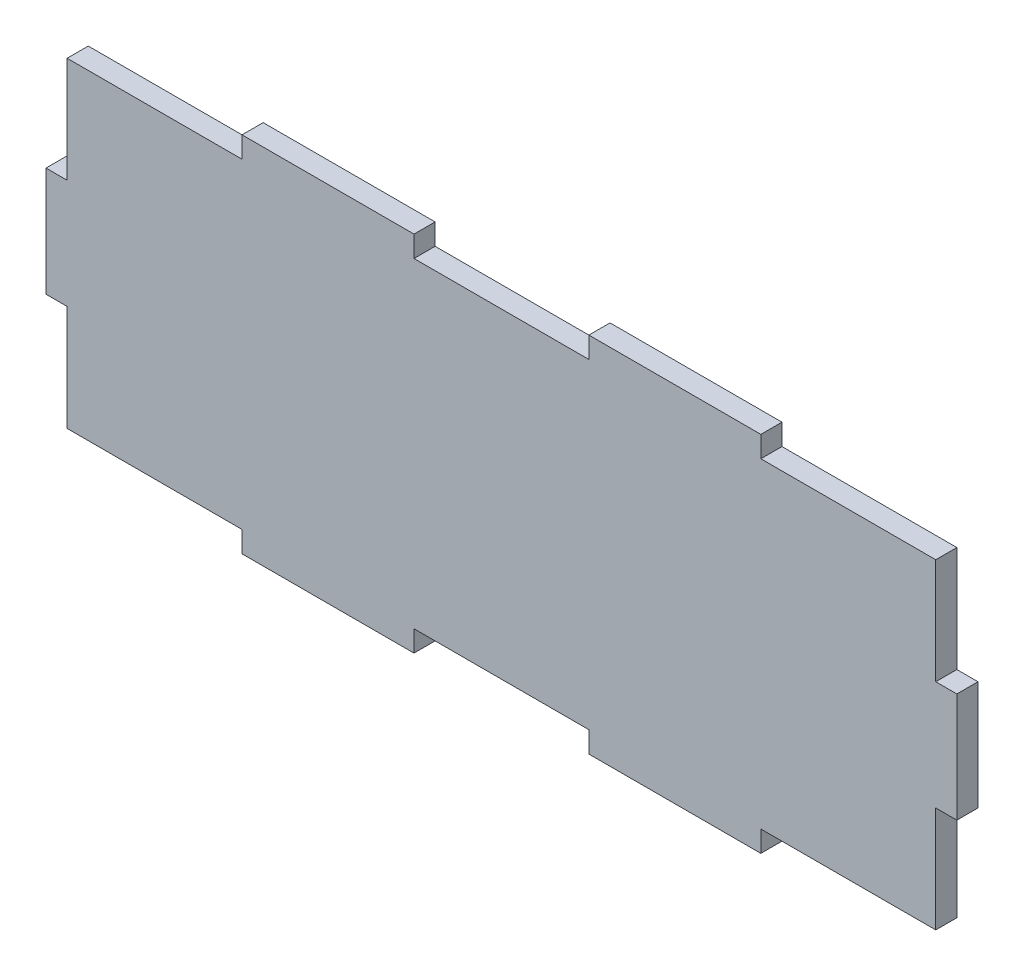
ISO-10303-21;
HEADER;
FILE_DESCRIPTION(('STEP AP214'),'2;1');
FILE_NAME('part.step','',(''),(''),'','','');
FILE_SCHEMA(('AUTOMOTIVE_DESIGN { 1 0 10303 214 1 1 1 1 }'));
ENDSEC;
DATA;
#1=APPLICATION_CONTEXT('core data for automotive mechanical design processes');
#2=APPLICATION_PROTOCOL_DEFINITION('international standard','automotive_design',2000,#1);
#3=PRODUCT_CONTEXT('',#1,'mechanical');
#4=PRODUCT('Part','Part','',(#3));
#5=PRODUCT_RELATED_PRODUCT_CATEGORY('part','',(#4));
#6=PRODUCT_DEFINITION_FORMATION('','',#4);
#7=PRODUCT_DEFINITION_CONTEXT('part definition',#1,'design');
#8=PRODUCT_DEFINITION('design','',#6,#7);
#9=PRODUCT_DEFINITION_SHAPE('','',#8);
#10=(LENGTH_UNIT() NAMED_UNIT(*) SI_UNIT(.MILLI.,.METRE.));
#11=(NAMED_UNIT(*) PLANE_ANGLE_UNIT() SI_UNIT($,.RADIAN.));
#12=(NAMED_UNIT(*) SI_UNIT($,.STERADIAN.) SOLID_ANGLE_UNIT());
#13=UNCERTAINTY_MEASURE_WITH_UNIT(LENGTH_MEASURE(1.E-05),#10,'distance_accuracy_value','');
#14=(GEOMETRIC_REPRESENTATION_CONTEXT(3) GLOBAL_UNCERTAINTY_ASSIGNED_CONTEXT((#13)) GLOBAL_UNIT_ASSIGNED_CONTEXT((#10,
#11,#12)) REPRESENTATION_CONTEXT('',''));
#15=CARTESIAN_POINT('',(0.,0.,0.));
#16=DIRECTION('',(0.,0.,1.));
#17=DIRECTION('',(1.,0.,0.));
#18=AXIS2_PLACEMENT_3D('',#15,#16,#17);
#19=CARTESIAN_POINT('',(0.,0.,5.8));
#20=DIRECTION('',(0.,1.,0.));
#21=DIRECTION('',(0.,0.,1.));
#22=AXIS2_PLACEMENT_3D('',#19,#20,#21);
#23=PLANE('',#22);
#24=DIRECTION('',(1.,0.,0.));
#25=VECTOR('',#24,1.);
#26=CARTESIAN_POINT('',(0.,0.,5.8));
#27=LINE('',#26,#25);
#28=CARTESIAN_POINT('',(190.4,0.,5.8));
#29=VERTEX_POINT('',#28);
#30=CARTESIAN_POINT('',(238.4,0.,5.8));
#31=VERTEX_POINT('',#30);
#32=EDGE_CURVE('E50',#29,#31,#27,.T.);
#33=ORIENTED_EDGE('',*,*,#32,.F.);
#34=DIRECTION('',(0.,0.,1.));
#35=VECTOR('',#34,1.);
#36=CARTESIAN_POINT('',(190.4,0.,-47.555020765425));
#37=LINE('',#36,#35);
#38=CARTESIAN_POINT('',(190.4,0.,0.));
#39=VERTEX_POINT('',#38);
#40=EDGE_CURVE('E232',#39,#29,#37,.T.);
#41=ORIENTED_EDGE('',*,*,#40,.F.);
#42=DIRECTION('',(1.,0.,0.));
#43=VECTOR('',#42,1.);
#44=CARTESIAN_POINT('',(0.,0.,0.));
#45=LINE('',#44,#43);
#46=CARTESIAN_POINT('',(238.4,0.,0.));
#47=VERTEX_POINT('',#46);
#48=EDGE_CURVE('E230',#39,#47,#45,.T.);
#49=ORIENTED_EDGE('',*,*,#48,.T.);
#50=DIRECTION('',(0.,0.,-1.));
#51=VECTOR('',#50,1.);
#52=CARTESIAN_POINT('',(238.4,0.,5.8));
#53=LINE('',#52,#51);
#54=EDGE_CURVE('E43',#31,#47,#53,.T.);
#55=ORIENTED_EDGE('',*,*,#54,.F.);
#56=EDGE_LOOP('',(#33,#41,#49,#55));
#57=FACE_BOUND('',#56,.T.);
#58=ADVANCED_FACE('F35',(#57),#23,.F.);
#59=CARTESIAN_POINT('',(95.2,0.,0.));
#60=VERTEX_POINT('',#59);
#61=CARTESIAN_POINT('',(143.2,0.,0.));
#62=VERTEX_POINT('',#61);
#63=EDGE_CURVE('E415',#60,#62,#45,.T.);
#64=ORIENTED_EDGE('',*,*,#63,.T.);
#65=DIRECTION('',(0.,0.,1.));
#66=VECTOR('',#65,1.);
#67=CARTESIAN_POINT('',(143.2,0.,-47.555020765425));
#68=LINE('',#67,#66);
#69=CARTESIAN_POINT('',(143.2,0.,5.8));
#70=VERTEX_POINT('',#69);
#71=EDGE_CURVE('E58',#62,#70,#68,.T.);
#72=ORIENTED_EDGE('',*,*,#71,.T.);
#73=CARTESIAN_POINT('',(95.2,0.,5.8));
#74=VERTEX_POINT('',#73);
#75=EDGE_CURVE('E398',#74,#70,#27,.T.);
#76=ORIENTED_EDGE('',*,*,#75,.F.);
#77=DIRECTION('',(0.,0.,1.));
#78=VECTOR('',#77,1.);
#79=CARTESIAN_POINT('',(95.2,0.,-47.555020765425));
#80=LINE('',#79,#78);
#81=EDGE_CURVE('E278',#60,#74,#80,.T.);
#82=ORIENTED_EDGE('',*,*,#81,.F.);
#83=EDGE_LOOP('',(#64,#72,#76,#82));
#84=FACE_BOUND('',#83,.T.);
#85=ADVANCED_FACE('F446',(#84),#23,.F.);
#86=CARTESIAN_POINT('',(0.,88.,5.8));
#87=DIRECTION('',(0.,-1.,0.));
#88=DIRECTION('',(0.,0.,-1.));
#89=AXIS2_PLACEMENT_3D('',#86,#87,#88);
#90=PLANE('',#89);
#91=DIRECTION('',(-1.,0.,0.));
#92=VECTOR('',#91,1.);
#93=CARTESIAN_POINT('',(0.,88.,0.));
#94=LINE('',#93,#92);
#95=CARTESIAN_POINT('',(238.4,88.,0.));
#96=VERTEX_POINT('',#95);
#97=CARTESIAN_POINT('',(190.4,88.,0.));
#98=VERTEX_POINT('',#97);
#99=EDGE_CURVE('E420',#96,#98,#94,.T.);
#100=ORIENTED_EDGE('',*,*,#99,.T.);
#101=DIRECTION('',(0.,0.,1.));
#102=VECTOR('',#101,1.);
#103=CARTESIAN_POINT('',(190.4,88.,-47.555020765425));
#104=LINE('',#103,#102);
#105=CARTESIAN_POINT('',(190.4,88.,5.8));
#106=VERTEX_POINT('',#105);
#107=EDGE_CURVE('E288',#98,#106,#104,.T.);
#108=ORIENTED_EDGE('',*,*,#107,.T.);
#109=DIRECTION('',(-1.,0.,0.));
#110=VECTOR('',#109,1.);
#111=CARTESIAN_POINT('',(0.,88.,5.8));
#112=LINE('',#111,#110);
#113=CARTESIAN_POINT('',(238.4,88.,5.8));
#114=VERTEX_POINT('',#113);
#115=EDGE_CURVE('E403',#114,#106,#112,.T.);
#116=ORIENTED_EDGE('',*,*,#115,.F.);
#117=DIRECTION('',(0.,0.,-1.));
#118=VECTOR('',#117,1.);
#119=CARTESIAN_POINT('',(238.4,88.,5.8));
#120=LINE('',#119,#118);
#121=EDGE_CURVE('E425',#114,#96,#120,.T.);
#122=ORIENTED_EDGE('',*,*,#121,.T.);
#123=EDGE_LOOP('',(#100,#108,#116,#122));
#124=FACE_BOUND('',#123,.T.);
#125=ADVANCED_FACE('F451',(#124),#90,.F.);
#126=DIRECTION('',(0.,0.,1.));
#127=VECTOR('',#126,1.);
#128=CARTESIAN_POINT('',(48.,88.,-47.555020765425));
#129=LINE('',#128,#127);
#130=CARTESIAN_POINT('',(48.,88.,0.));
#131=VERTEX_POINT('',#130);
#132=CARTESIAN_POINT('',(48.,88.,5.8));
#133=VERTEX_POINT('',#132);
#134=EDGE_CURVE('E323',#131,#133,#129,.T.);
#135=ORIENTED_EDGE('',*,*,#134,.F.);
#136=CARTESIAN_POINT('',(0.,88.,0.));
#137=VERTEX_POINT('',#136);
#138=EDGE_CURVE('E419',#131,#137,#94,.T.);
#139=ORIENTED_EDGE('',*,*,#138,.T.);
#140=DIRECTION('',(0.,0.,-1.));
#141=VECTOR('',#140,1.);
#142=CARTESIAN_POINT('',(0.,88.,5.8));
#143=LINE('',#142,#141);
#144=CARTESIAN_POINT('',(0.,88.,5.8));
#145=VERTEX_POINT('',#144);
#146=EDGE_CURVE('E406',#145,#137,#143,.T.);
#147=ORIENTED_EDGE('',*,*,#146,.F.);
#148=EDGE_CURVE('E402',#133,#145,#112,.T.);
#149=ORIENTED_EDGE('',*,*,#148,.F.);
#150=EDGE_LOOP('',(#135,#139,#147,#149));
#151=FACE_BOUND('',#150,.T.);
#152=ADVANCED_FACE('F492',(#151),#90,.F.);
#153=CARTESIAN_POINT('',(238.4,0.,5.8));
#154=DIRECTION('',(-1.,0.,0.));
#155=DIRECTION('',(0.,0.,1.));
#156=AXIS2_PLACEMENT_3D('',#153,#154,#155);
#157=PLANE('',#156);
#158=DIRECTION('',(0.,0.,1.));
#159=VECTOR('',#158,1.);
#160=CARTESIAN_POINT('',(238.4,59.,-47.555020765425));
#161=LINE('',#160,#159);
#162=CARTESIAN_POINT('',(238.4,59.,0.));
#163=VERTEX_POINT('',#162);
#164=CARTESIAN_POINT('',(238.4,59.,5.8));
#165=VERTEX_POINT('',#164);
#166=EDGE_CURVE('E352',#163,#165,#161,.T.);
#167=ORIENTED_EDGE('',*,*,#166,.F.);
#168=DIRECTION('',(0.,1.,0.));
#169=VECTOR('',#168,1.);
#170=CARTESIAN_POINT('',(238.4,0.,0.));
#171=LINE('',#170,#169);
#172=EDGE_CURVE('E414',#163,#96,#171,.T.);
#173=ORIENTED_EDGE('',*,*,#172,.T.);
#174=ORIENTED_EDGE('',*,*,#121,.F.);
#175=DIRECTION('',(0.,1.,0.));
#176=VECTOR('',#175,1.);
#177=CARTESIAN_POINT('',(238.4,0.,5.8));
#178=LINE('',#177,#176);
#179=EDGE_CURVE('E397',#165,#114,#178,.T.);
#180=ORIENTED_EDGE('',*,*,#179,.F.);
#181=EDGE_LOOP('',(#167,#173,#174,#180));
#182=FACE_BOUND('',#181,.T.);
#183=ADVANCED_FACE('F460',(#182),#157,.F.);
#184=CARTESIAN_POINT('',(0.,0.,5.8));
#185=DIRECTION('',(1.,0.,0.));
#186=DIRECTION('',(0.,0.,-1.));
#187=AXIS2_PLACEMENT_3D('',#184,#185,#186);
#188=PLANE('',#187);
#189=DIRECTION('',(0.,0.,1.));
#190=VECTOR('',#189,1.);
#191=CARTESIAN_POINT('',(0.,29.,-47.555020765425));
#192=LINE('',#191,#190);
#193=CARTESIAN_POINT('',(0.,29.,0.));
#194=VERTEX_POINT('',#193);
#195=CARTESIAN_POINT('',(0.,29.,5.8));
#196=VERTEX_POINT('',#195);
#197=EDGE_CURVE('E378',#194,#196,#192,.T.);
#198=ORIENTED_EDGE('',*,*,#197,.F.);
#199=DIRECTION('',(0.,-1.,0.));
#200=VECTOR('',#199,1.);
#201=CARTESIAN_POINT('',(0.,0.,0.));
#202=LINE('',#201,#200);
#203=CARTESIAN_POINT('',(0.,0.,0.));
#204=VERTEX_POINT('',#203);
#205=EDGE_CURVE('E389',#194,#204,#202,.T.);
#206=ORIENTED_EDGE('',*,*,#205,.T.);
#207=DIRECTION('',(0.,0.,-1.));
#208=VECTOR('',#207,1.);
#209=CARTESIAN_POINT('',(0.,0.,5.8));
#210=LINE('',#209,#208);
#211=CARTESIAN_POINT('',(0.,0.,5.8));
#212=VERTEX_POINT('',#211);
#213=EDGE_CURVE('E11',#212,#204,#210,.T.);
#214=ORIENTED_EDGE('',*,*,#213,.F.);
#215=DIRECTION('',(0.,-1.,0.));
#216=VECTOR('',#215,1.);
#217=CARTESIAN_POINT('',(0.,0.,5.8));
#218=LINE('',#217,#216);
#219=EDGE_CURVE('E393',#196,#212,#218,.T.);
#220=ORIENTED_EDGE('',*,*,#219,.F.);
#221=EDGE_LOOP('',(#198,#206,#214,#220));
#222=FACE_BOUND('',#221,.T.);
#223=ADVANCED_FACE('F461',(#222),#188,.F.);
#224=CARTESIAN_POINT('',(0.,59.,0.));
#225=VERTEX_POINT('',#224);
#226=EDGE_CURVE('E408',#137,#225,#202,.T.);
#227=ORIENTED_EDGE('',*,*,#226,.T.);
#228=DIRECTION('',(0.,0.,1.));
#229=VECTOR('',#228,1.);
#230=CARTESIAN_POINT('',(0.,59.,-47.555020765425));
#231=LINE('',#230,#229);
#232=CARTESIAN_POINT('',(0.,59.,5.8));
#233=VERTEX_POINT('',#232);
#234=EDGE_CURVE('E384',#225,#233,#231,.T.);
#235=ORIENTED_EDGE('',*,*,#234,.T.);
#236=EDGE_CURVE('E390',#145,#233,#218,.T.);
#237=ORIENTED_EDGE('',*,*,#236,.F.);
#238=ORIENTED_EDGE('',*,*,#146,.T.);
#239=EDGE_LOOP('',(#227,#235,#237,#238));
#240=FACE_BOUND('',#239,.T.);
#241=ADVANCED_FACE('F37',(#240),#188,.F.);
#242=CARTESIAN_POINT('',(48.,0.,0.));
#243=VERTEX_POINT('',#242);
#244=EDGE_CURVE('E411',#204,#243,#45,.T.);
#245=ORIENTED_EDGE('',*,*,#244,.T.);
#246=DIRECTION('',(0.,0.,1.));
#247=VECTOR('',#246,1.);
#248=CARTESIAN_POINT('',(48.,0.,-47.555020765425));
#249=LINE('',#248,#247);
#250=CARTESIAN_POINT('',(48.,0.,5.8));
#251=VERTEX_POINT('',#250);
#252=EDGE_CURVE('E275',#243,#251,#249,.T.);
#253=ORIENTED_EDGE('',*,*,#252,.T.);
#254=EDGE_CURVE('E394',#212,#251,#27,.T.);
#255=ORIENTED_EDGE('',*,*,#254,.F.);
#256=ORIENTED_EDGE('',*,*,#213,.T.);
#257=EDGE_LOOP('',(#245,#253,#255,#256));
#258=FACE_BOUND('',#257,.T.);
#259=ADVANCED_FACE('F447',(#258),#23,.F.);
#260=CARTESIAN_POINT('',(238.4,29.,0.));
#261=VERTEX_POINT('',#260);
#262=EDGE_CURVE('E416',#47,#261,#171,.T.);
#263=ORIENTED_EDGE('',*,*,#262,.T.);
#264=DIRECTION('',(0.,0.,1.));
#265=VECTOR('',#264,1.);
#266=CARTESIAN_POINT('',(238.4,29.,-47.555020765425));
#267=LINE('',#266,#265);
#268=CARTESIAN_POINT('',(238.4,29.,5.8));
#269=VERTEX_POINT('',#268);
#270=EDGE_CURVE('E358',#261,#269,#267,.T.);
#271=ORIENTED_EDGE('',*,*,#270,.T.);
#272=EDGE_CURVE('E399',#31,#269,#178,.T.);
#273=ORIENTED_EDGE('',*,*,#272,.F.);
#274=ORIENTED_EDGE('',*,*,#54,.T.);
#275=EDGE_LOOP('',(#263,#271,#273,#274));
#276=FACE_BOUND('',#275,.T.);
#277=ADVANCED_FACE('F430',(#276),#157,.F.);
#278=CARTESIAN_POINT('',(143.2,88.,5.8));
#279=VERTEX_POINT('',#278);
#280=CARTESIAN_POINT('',(95.2,88.,5.8));
#281=VERTEX_POINT('',#280);
#282=EDGE_CURVE('E407',#279,#281,#112,.T.);
#283=ORIENTED_EDGE('',*,*,#282,.F.);
#284=DIRECTION('',(0.,0.,1.));
#285=VECTOR('',#284,1.);
#286=CARTESIAN_POINT('',(143.2,88.,-47.555020765425));
#287=LINE('',#286,#285);
#288=CARTESIAN_POINT('',(143.2,88.,0.));
#289=VERTEX_POINT('',#288);
#290=EDGE_CURVE('E297',#289,#279,#287,.T.);
#291=ORIENTED_EDGE('',*,*,#290,.F.);
#292=CARTESIAN_POINT('',(95.2,88.,0.));
#293=VERTEX_POINT('',#292);
#294=EDGE_CURVE('E422',#289,#293,#94,.T.);
#295=ORIENTED_EDGE('',*,*,#294,.T.);
#296=DIRECTION('',(0.,0.,1.));
#297=VECTOR('',#296,1.);
#298=CARTESIAN_POINT('',(95.2,88.,-47.555020765425));
#299=LINE('',#298,#297);
#300=EDGE_CURVE('E315',#293,#281,#299,.T.);
#301=ORIENTED_EDGE('',*,*,#300,.T.);
#302=EDGE_LOOP('',(#283,#291,#295,#301));
#303=FACE_BOUND('',#302,.T.);
#304=ADVANCED_FACE('F459',(#303),#90,.F.);
#305=CARTESIAN_POINT('',(0.,0.,5.8));
#306=DIRECTION('',(0.,0.,-1.));
#307=DIRECTION('',(-1.,0.,0.));
#308=AXIS2_PLACEMENT_3D('',#305,#306,#307);
#309=PLANE('',#308);
#310=ORIENTED_EDGE('',*,*,#236,.T.);
#311=DIRECTION('',(-1.,0.,0.));
#312=VECTOR('',#311,1.);
#313=CARTESIAN_POINT('',(0.,59.,5.8));
#314=LINE('',#313,#312);
#315=CARTESIAN_POINT('',(-5.79999999999994,59.,5.8));
#316=VERTEX_POINT('',#315);
#317=EDGE_CURVE('E363',#233,#316,#314,.T.);
#318=ORIENTED_EDGE('',*,*,#317,.T.);
#319=DIRECTION('',(0.,-1.,0.));
#320=VECTOR('',#319,1.);
#321=CARTESIAN_POINT('',(-5.79999999999994,59.,5.8));
#322=LINE('',#321,#320);
#323=CARTESIAN_POINT('',(-5.79999999999996,29.,5.8));
#324=VERTEX_POINT('',#323);
#325=EDGE_CURVE('E368',#316,#324,#322,.T.);
#326=ORIENTED_EDGE('',*,*,#325,.T.);
#327=DIRECTION('',(1.,0.,0.));
#328=VECTOR('',#327,1.);
#329=CARTESIAN_POINT('',(0.,29.,5.8));
#330=LINE('',#329,#328);
#331=EDGE_CURVE('E364',#324,#196,#330,.T.);
#332=ORIENTED_EDGE('',*,*,#331,.T.);
#333=ORIENTED_EDGE('',*,*,#219,.T.);
#334=ORIENTED_EDGE('',*,*,#254,.T.);
#335=DIRECTION('',(0.,-1.,0.));
#336=VECTOR('',#335,1.);
#337=CARTESIAN_POINT('',(48.,0.,5.8));
#338=LINE('',#337,#336);
#339=CARTESIAN_POINT('',(48.,-5.79999999999995,5.8));
#340=VERTEX_POINT('',#339);
#341=EDGE_CURVE('E258',#251,#340,#338,.T.);
#342=ORIENTED_EDGE('',*,*,#341,.T.);
#343=DIRECTION('',(1.,0.,0.));
#344=VECTOR('',#343,1.);
#345=CARTESIAN_POINT('',(48.,-5.79999999999995,5.8));
#346=LINE('',#345,#344);
#347=CARTESIAN_POINT('',(95.2,-5.79999999999995,5.8));
#348=VERTEX_POINT('',#347);
#349=EDGE_CURVE('E263',#340,#348,#346,.T.);
#350=ORIENTED_EDGE('',*,*,#349,.T.);
#351=DIRECTION('',(0.,1.,0.));
#352=VECTOR('',#351,1.);
#353=CARTESIAN_POINT('',(95.2,0.,5.8));
#354=LINE('',#353,#352);
#355=EDGE_CURVE('E259',#348,#74,#354,.T.);
#356=ORIENTED_EDGE('',*,*,#355,.T.);
#357=ORIENTED_EDGE('',*,*,#75,.T.);
#358=DIRECTION('',(0.,-1.,0.));
#359=VECTOR('',#358,1.);
#360=CARTESIAN_POINT('',(143.2,0.,5.8));
#361=LINE('',#360,#359);
#362=CARTESIAN_POINT('',(143.2,-5.79999999999995,5.8));
#363=VERTEX_POINT('',#362);
#364=EDGE_CURVE('E251',#70,#363,#361,.T.);
#365=ORIENTED_EDGE('',*,*,#364,.T.);
#366=DIRECTION('',(1.,0.,0.));
#367=VECTOR('',#366,1.);
#368=CARTESIAN_POINT('',(143.2,-5.79999999999995,5.8));
#369=LINE('',#368,#367);
#370=CARTESIAN_POINT('',(190.4,-5.79999999999995,5.8));
#371=VERTEX_POINT('',#370);
#372=EDGE_CURVE('E247',#363,#371,#369,.T.);
#373=ORIENTED_EDGE('',*,*,#372,.T.);
#374=DIRECTION('',(0.,1.,0.));
#375=VECTOR('',#374,1.);
#376=CARTESIAN_POINT('',(190.4,0.,5.8));
#377=LINE('',#376,#375);
#378=EDGE_CURVE('E238',#371,#29,#377,.T.);
#379=ORIENTED_EDGE('',*,*,#378,.T.);
#380=ORIENTED_EDGE('',*,*,#32,.T.);
#381=ORIENTED_EDGE('',*,*,#272,.T.);
#382=DIRECTION('',(1.,0.,0.));
#383=VECTOR('',#382,1.);
#384=CARTESIAN_POINT('',(238.4,29.,5.8));
#385=LINE('',#384,#383);
#386=CARTESIAN_POINT('',(244.2,29.,5.8));
#387=VERTEX_POINT('',#386);
#388=EDGE_CURVE('E337',#269,#387,#385,.T.);
#389=ORIENTED_EDGE('',*,*,#388,.T.);
#390=DIRECTION('',(0.,1.,0.));
#391=VECTOR('',#390,1.);
#392=CARTESIAN_POINT('',(244.2,59.,5.8));
#393=LINE('',#392,#391);
#394=CARTESIAN_POINT('',(244.2,59.,5.8));
#395=VERTEX_POINT('',#394);
#396=EDGE_CURVE('E342',#387,#395,#393,.T.);
#397=ORIENTED_EDGE('',*,*,#396,.T.);
#398=DIRECTION('',(-1.,0.,0.));
#399=VECTOR('',#398,1.);
#400=CARTESIAN_POINT('',(238.4,59.,5.8));
#401=LINE('',#400,#399);
#402=EDGE_CURVE('E338',#395,#165,#401,.T.);
#403=ORIENTED_EDGE('',*,*,#402,.T.);
#404=ORIENTED_EDGE('',*,*,#179,.T.);
#405=ORIENTED_EDGE('',*,*,#115,.T.);
#406=DIRECTION('',(0.,1.,0.));
#407=VECTOR('',#406,1.);
#408=CARTESIAN_POINT('',(190.4,88.,5.8));
#409=LINE('',#408,#407);
#410=CARTESIAN_POINT('',(190.4,93.8,5.8));
#411=VERTEX_POINT('',#410);
#412=EDGE_CURVE('E289',#106,#411,#409,.T.);
#413=ORIENTED_EDGE('',*,*,#412,.T.);
#414=DIRECTION('',(-1.,0.,0.));
#415=VECTOR('',#414,1.);
#416=CARTESIAN_POINT('',(143.2,93.8,5.8));
#417=LINE('',#416,#415);
#418=CARTESIAN_POINT('',(143.2,93.8,5.8));
#419=VERTEX_POINT('',#418);
#420=EDGE_CURVE('E285',#411,#419,#417,.T.);
#421=ORIENTED_EDGE('',*,*,#420,.T.);
#422=DIRECTION('',(0.,-1.,0.));
#423=VECTOR('',#422,1.);
#424=CARTESIAN_POINT('',(143.2,88.,5.8));
#425=LINE('',#424,#423);
#426=EDGE_CURVE('E284',#419,#279,#425,.T.);
#427=ORIENTED_EDGE('',*,*,#426,.T.);
#428=ORIENTED_EDGE('',*,*,#282,.T.);
#429=DIRECTION('',(0.,1.,0.));
#430=VECTOR('',#429,1.);
#431=CARTESIAN_POINT('',(95.2,88.,5.8));
#432=LINE('',#431,#430);
#433=CARTESIAN_POINT('',(95.2,93.8,5.8));
#434=VERTEX_POINT('',#433);
#435=EDGE_CURVE('E316',#281,#434,#432,.T.);
#436=ORIENTED_EDGE('',*,*,#435,.T.);
#437=DIRECTION('',(-1.,0.,0.));
#438=VECTOR('',#437,1.);
#439=CARTESIAN_POINT('',(48.,93.8,5.8));
#440=LINE('',#439,#438);
#441=CARTESIAN_POINT('',(48.,93.8,5.8));
#442=VERTEX_POINT('',#441);
#443=EDGE_CURVE('E312',#434,#442,#440,.T.);
#444=ORIENTED_EDGE('',*,*,#443,.T.);
#445=DIRECTION('',(0.,-1.,0.));
#446=VECTOR('',#445,1.);
#447=CARTESIAN_POINT('',(48.,88.,5.8));
#448=LINE('',#447,#446);
#449=EDGE_CURVE('E311',#442,#133,#448,.T.);
#450=ORIENTED_EDGE('',*,*,#449,.T.);
#451=ORIENTED_EDGE('',*,*,#148,.T.);
#452=EDGE_LOOP('',(#310,#318,#326,#332,#333,#334,#342,#350,#356,#357,#365,#373,#379,#380,#381,
#389,#397,#403,#404,#405,#413,#421,#427,#428,#436,#444,#450,#451));
#453=FACE_BOUND('',#452,.T.);
#454=ADVANCED_FACE('F436',(#453),#309,.F.);
#455=CARTESIAN_POINT('',(0.,0.,0.));
#456=DIRECTION('',(0.,0.,-1.));
#457=DIRECTION('',(-1.,0.,0.));
#458=AXIS2_PLACEMENT_3D('',#455,#456,#457);
#459=PLANE('',#458);
#460=ORIENTED_EDGE('',*,*,#226,.F.);
#461=ORIENTED_EDGE('',*,*,#138,.F.);
#462=DIRECTION('',(0.,-1.,0.));
#463=VECTOR('',#462,1.);
#464=CARTESIAN_POINT('',(48.,88.,0.));
#465=LINE('',#464,#463);
#466=CARTESIAN_POINT('',(48.,93.8,0.));
#467=VERTEX_POINT('',#466);
#468=EDGE_CURVE('E321',#467,#131,#465,.T.);
#469=ORIENTED_EDGE('',*,*,#468,.F.);
#470=DIRECTION('',(-1.,0.,0.));
#471=VECTOR('',#470,1.);
#472=CARTESIAN_POINT('',(48.,93.8,0.));
#473=LINE('',#472,#471);
#474=CARTESIAN_POINT('',(95.2,93.8,0.));
#475=VERTEX_POINT('',#474);
#476=EDGE_CURVE('E325',#475,#467,#473,.T.);
#477=ORIENTED_EDGE('',*,*,#476,.F.);
#478=DIRECTION('',(0.,1.,0.));
#479=VECTOR('',#478,1.);
#480=CARTESIAN_POINT('',(95.2,88.,0.));
#481=LINE('',#480,#479);
#482=EDGE_CURVE('E329',#293,#475,#481,.T.);
#483=ORIENTED_EDGE('',*,*,#482,.F.);
#484=ORIENTED_EDGE('',*,*,#294,.F.);
#485=DIRECTION('',(0.,-1.,0.));
#486=VECTOR('',#485,1.);
#487=CARTESIAN_POINT('',(143.2,88.,0.));
#488=LINE('',#487,#486);
#489=CARTESIAN_POINT('',(143.2,93.8,0.));
#490=VERTEX_POINT('',#489);
#491=EDGE_CURVE('E294',#490,#289,#488,.T.);
#492=ORIENTED_EDGE('',*,*,#491,.F.);
#493=DIRECTION('',(-1.,0.,0.));
#494=VECTOR('',#493,1.);
#495=CARTESIAN_POINT('',(143.2,93.8,0.));
#496=LINE('',#495,#494);
#497=CARTESIAN_POINT('',(190.4,93.8,0.));
#498=VERTEX_POINT('',#497);
#499=EDGE_CURVE('E299',#498,#490,#496,.T.);
#500=ORIENTED_EDGE('',*,*,#499,.F.);
#501=DIRECTION('',(0.,1.,0.));
#502=VECTOR('',#501,1.);
#503=CARTESIAN_POINT('',(190.4,88.,0.));
#504=LINE('',#503,#502);
#505=EDGE_CURVE('E303',#98,#498,#504,.T.);
#506=ORIENTED_EDGE('',*,*,#505,.F.);
#507=ORIENTED_EDGE('',*,*,#99,.F.);
#508=ORIENTED_EDGE('',*,*,#172,.F.);
#509=DIRECTION('',(-1.,0.,0.));
#510=VECTOR('',#509,1.);
#511=CARTESIAN_POINT('',(238.4,59.,0.));
#512=LINE('',#511,#510);
#513=CARTESIAN_POINT('',(244.2,59.,0.));
#514=VERTEX_POINT('',#513);
#515=EDGE_CURVE('E350',#514,#163,#512,.T.);
#516=ORIENTED_EDGE('',*,*,#515,.F.);
#517=DIRECTION('',(0.,1.,0.));
#518=VECTOR('',#517,1.);
#519=CARTESIAN_POINT('',(244.2,59.,0.));
#520=LINE('',#519,#518);
#521=CARTESIAN_POINT('',(244.2,29.,0.));
#522=VERTEX_POINT('',#521);
#523=EDGE_CURVE('E354',#522,#514,#520,.T.);
#524=ORIENTED_EDGE('',*,*,#523,.F.);
#525=DIRECTION('',(1.,0.,0.));
#526=VECTOR('',#525,1.);
#527=CARTESIAN_POINT('',(238.4,29.,0.));
#528=LINE('',#527,#526);
#529=EDGE_CURVE('E341',#261,#522,#528,.T.);
#530=ORIENTED_EDGE('',*,*,#529,.F.);
#531=ORIENTED_EDGE('',*,*,#262,.F.);
#532=ORIENTED_EDGE('',*,*,#48,.F.);
#533=DIRECTION('',(0.,1.,0.));
#534=VECTOR('',#533,1.);
#535=CARTESIAN_POINT('',(190.4,0.,0.));
#536=LINE('',#535,#534);
#537=CARTESIAN_POINT('',(190.4,-5.79999999999995,0.));
#538=VERTEX_POINT('',#537);
#539=EDGE_CURVE('E221',#538,#39,#536,.T.);
#540=ORIENTED_EDGE('',*,*,#539,.F.);
#541=DIRECTION('',(1.,0.,0.));
#542=VECTOR('',#541,1.);
#543=CARTESIAN_POINT('',(143.2,-5.79999999999995,0.));
#544=LINE('',#543,#542);
#545=CARTESIAN_POINT('',(143.2,-5.79999999999995,0.));
#546=VERTEX_POINT('',#545);
#547=EDGE_CURVE('E227',#546,#538,#544,.T.);
#548=ORIENTED_EDGE('',*,*,#547,.F.);
#549=DIRECTION('',(0.,-1.,0.));
#550=VECTOR('',#549,1.);
#551=CARTESIAN_POINT('',(143.2,0.,0.));
#552=LINE('',#551,#550);
#553=EDGE_CURVE('E253',#62,#546,#552,.T.);
#554=ORIENTED_EDGE('',*,*,#553,.F.);
#555=ORIENTED_EDGE('',*,*,#63,.F.);
#556=DIRECTION('',(0.,1.,0.));
#557=VECTOR('',#556,1.);
#558=CARTESIAN_POINT('',(95.2,0.,0.));
#559=LINE('',#558,#557);
#560=CARTESIAN_POINT('',(95.2,-5.79999999999995,0.));
#561=VERTEX_POINT('',#560);
#562=EDGE_CURVE('E276',#561,#60,#559,.T.);
#563=ORIENTED_EDGE('',*,*,#562,.F.);
#564=DIRECTION('',(1.,0.,0.));
#565=VECTOR('',#564,1.);
#566=CARTESIAN_POINT('',(48.,-5.79999999999995,0.));
#567=LINE('',#566,#565);
#568=CARTESIAN_POINT('',(48.,-5.79999999999995,0.));
#569=VERTEX_POINT('',#568);
#570=EDGE_CURVE('E262',#569,#561,#567,.T.);
#571=ORIENTED_EDGE('',*,*,#570,.F.);
#572=DIRECTION('',(0.,-1.,0.));
#573=VECTOR('',#572,1.);
#574=CARTESIAN_POINT('',(48.,0.,0.));
#575=LINE('',#574,#573);
#576=EDGE_CURVE('E271',#243,#569,#575,.T.);
#577=ORIENTED_EDGE('',*,*,#576,.F.);
#578=ORIENTED_EDGE('',*,*,#244,.F.);
#579=ORIENTED_EDGE('',*,*,#205,.F.);
#580=DIRECTION('',(1.,0.,0.));
#581=VECTOR('',#580,1.);
#582=CARTESIAN_POINT('',(0.,29.,0.));
#583=LINE('',#582,#581);
#584=CARTESIAN_POINT('',(-5.79999999999996,29.,0.));
#585=VERTEX_POINT('',#584);
#586=EDGE_CURVE('E376',#585,#194,#583,.T.);
#587=ORIENTED_EDGE('',*,*,#586,.F.);
#588=DIRECTION('',(0.,-1.,0.));
#589=VECTOR('',#588,1.);
#590=CARTESIAN_POINT('',(-5.79999999999994,59.,0.));
#591=LINE('',#590,#589);
#592=CARTESIAN_POINT('',(-5.79999999999994,59.,0.));
#593=VERTEX_POINT('',#592);
#594=EDGE_CURVE('E380',#593,#585,#591,.T.);
#595=ORIENTED_EDGE('',*,*,#594,.F.);
#596=DIRECTION('',(-1.,0.,0.));
#597=VECTOR('',#596,1.);
#598=CARTESIAN_POINT('',(0.,59.,0.));
#599=LINE('',#598,#597);
#600=EDGE_CURVE('E367',#225,#593,#599,.T.);
#601=ORIENTED_EDGE('',*,*,#600,.F.);
#602=EDGE_LOOP('',(#460,#461,#469,#477,#483,#484,#492,#500,#506,#507,#508,#516,#524,#530,#531,
#532,#540,#548,#554,#555,#563,#571,#577,#578,#579,#587,#595,#601));
#603=FACE_BOUND('',#602,.T.);
#604=ADVANCED_FACE('F224',(#603),#459,.T.);
#605=CARTESIAN_POINT('',(0.,59.,-47.555020765425));
#606=DIRECTION('',(0.,1.,0.));
#607=DIRECTION('',(-1.,0.,0.));
#608=AXIS2_PLACEMENT_3D('',#605,#606,#607);
#609=PLANE('',#608);
#610=ORIENTED_EDGE('',*,*,#234,.F.);
#611=ORIENTED_EDGE('',*,*,#600,.T.);
#612=DIRECTION('',(0.,0.,1.));
#613=VECTOR('',#612,1.);
#614=CARTESIAN_POINT('',(-5.79999999999994,59.,-47.555020765425));
#615=LINE('',#614,#613);
#616=EDGE_CURVE('E375',#593,#316,#615,.T.);
#617=ORIENTED_EDGE('',*,*,#616,.T.);
#618=ORIENTED_EDGE('',*,*,#317,.F.);
#619=EDGE_LOOP('',(#610,#611,#617,#618));
#620=FACE_BOUND('',#619,.T.);
#621=ADVANCED_FACE('F486',(#620),#609,.T.);
#622=CARTESIAN_POINT('',(-5.79999999999994,59.,-47.555020765425));
#623=DIRECTION('',(-1.,0.,0.));
#624=DIRECTION('',(0.,-1.,0.));
#625=AXIS2_PLACEMENT_3D('',#622,#623,#624);
#626=PLANE('',#625);
#627=ORIENTED_EDGE('',*,*,#616,.F.);
#628=ORIENTED_EDGE('',*,*,#594,.T.);
#629=DIRECTION('',(0.,0.,1.));
#630=VECTOR('',#629,1.);
#631=CARTESIAN_POINT('',(-5.79999999999996,29.,-47.555020765425));
#632=LINE('',#631,#630);
#633=EDGE_CURVE('E379',#585,#324,#632,.T.);
#634=ORIENTED_EDGE('',*,*,#633,.T.);
#635=ORIENTED_EDGE('',*,*,#325,.F.);
#636=EDGE_LOOP('',(#627,#628,#634,#635));
#637=FACE_BOUND('',#636,.T.);
#638=ADVANCED_FACE('F482',(#637),#626,.T.);
#639=CARTESIAN_POINT('',(0.,29.,-47.555020765425));
#640=DIRECTION('',(0.,-1.,0.));
#641=DIRECTION('',(1.,0.,0.));
#642=AXIS2_PLACEMENT_3D('',#639,#640,#641);
#643=PLANE('',#642);
#644=ORIENTED_EDGE('',*,*,#633,.F.);
#645=ORIENTED_EDGE('',*,*,#586,.T.);
#646=ORIENTED_EDGE('',*,*,#197,.T.);
#647=ORIENTED_EDGE('',*,*,#331,.F.);
#648=EDGE_LOOP('',(#644,#645,#646,#647));
#649=FACE_BOUND('',#648,.T.);
#650=ADVANCED_FACE('F478',(#649),#643,.T.);
#651=CARTESIAN_POINT('',(238.4,29.,-47.555020765425));
#652=DIRECTION('',(0.,-1.,0.));
#653=DIRECTION('',(1.,0.,0.));
#654=AXIS2_PLACEMENT_3D('',#651,#652,#653);
#655=PLANE('',#654);
#656=ORIENTED_EDGE('',*,*,#270,.F.);
#657=ORIENTED_EDGE('',*,*,#529,.T.);
#658=DIRECTION('',(0.,0.,1.));
#659=VECTOR('',#658,1.);
#660=CARTESIAN_POINT('',(244.2,29.,-47.555020765425));
#661=LINE('',#660,#659);
#662=EDGE_CURVE('E349',#522,#387,#661,.T.);
#663=ORIENTED_EDGE('',*,*,#662,.T.);
#664=ORIENTED_EDGE('',*,*,#388,.F.);
#665=EDGE_LOOP('',(#656,#657,#663,#664));
#666=FACE_BOUND('',#665,.T.);
#667=ADVANCED_FACE('F434',(#666),#655,.T.);
#668=CARTESIAN_POINT('',(244.2,59.,-47.555020765425));
#669=DIRECTION('',(1.,0.,0.));
#670=DIRECTION('',(0.,0.,-1.));
#671=AXIS2_PLACEMENT_3D('',#668,#669,#670);
#672=PLANE('',#671);
#673=ORIENTED_EDGE('',*,*,#662,.F.);
#674=ORIENTED_EDGE('',*,*,#523,.T.);
#675=DIRECTION('',(0.,0.,1.));
#676=VECTOR('',#675,1.);
#677=CARTESIAN_POINT('',(244.2,59.,-47.555020765425));
#678=LINE('',#677,#676);
#679=EDGE_CURVE('E353',#514,#395,#678,.T.);
#680=ORIENTED_EDGE('',*,*,#679,.T.);
#681=ORIENTED_EDGE('',*,*,#396,.F.);
#682=EDGE_LOOP('',(#673,#674,#680,#681));
#683=FACE_BOUND('',#682,.T.);
#684=ADVANCED_FACE('F526',(#683),#672,.T.);
#685=CARTESIAN_POINT('',(238.4,59.,-47.555020765425));
#686=DIRECTION('',(0.,1.,0.));
#687=DIRECTION('',(0.,0.,1.));
#688=AXIS2_PLACEMENT_3D('',#685,#686,#687);
#689=PLANE('',#688);
#690=ORIENTED_EDGE('',*,*,#679,.F.);
#691=ORIENTED_EDGE('',*,*,#515,.T.);
#692=ORIENTED_EDGE('',*,*,#166,.T.);
#693=ORIENTED_EDGE('',*,*,#402,.F.);
#694=EDGE_LOOP('',(#690,#691,#692,#693));
#695=FACE_BOUND('',#694,.T.);
#696=ADVANCED_FACE('F523',(#695),#689,.T.);
#697=CARTESIAN_POINT('',(95.2,88.,-47.555020765425));
#698=DIRECTION('',(1.,0.,0.));
#699=DIRECTION('',(0.,1.,0.));
#700=AXIS2_PLACEMENT_3D('',#697,#698,#699);
#701=PLANE('',#700);
#702=ORIENTED_EDGE('',*,*,#300,.F.);
#703=ORIENTED_EDGE('',*,*,#482,.T.);
#704=DIRECTION('',(0.,0.,1.));
#705=VECTOR('',#704,1.);
#706=CARTESIAN_POINT('',(95.2,93.8,-47.555020765425));
#707=LINE('',#706,#705);
#708=EDGE_CURVE('E328',#475,#434,#707,.T.);
#709=ORIENTED_EDGE('',*,*,#708,.T.);
#710=ORIENTED_EDGE('',*,*,#435,.F.);
#711=EDGE_LOOP('',(#702,#703,#709,#710));
#712=FACE_BOUND('',#711,.T.);
#713=ADVANCED_FACE('F500',(#712),#701,.T.);
#714=CARTESIAN_POINT('',(48.,93.8,-47.555020765425));
#715=DIRECTION('',(0.,1.,0.));
#716=DIRECTION('',(0.,0.,1.));
#717=AXIS2_PLACEMENT_3D('',#714,#715,#716);
#718=PLANE('',#717);
#719=ORIENTED_EDGE('',*,*,#708,.F.);
#720=ORIENTED_EDGE('',*,*,#476,.T.);
#721=DIRECTION('',(0.,0.,1.));
#722=VECTOR('',#721,1.);
#723=CARTESIAN_POINT('',(48.,93.8,-47.555020765425));
#724=LINE('',#723,#722);
#725=EDGE_CURVE('E324',#467,#442,#724,.T.);
#726=ORIENTED_EDGE('',*,*,#725,.T.);
#727=ORIENTED_EDGE('',*,*,#443,.F.);
#728=EDGE_LOOP('',(#719,#720,#726,#727));
#729=FACE_BOUND('',#728,.T.);
#730=ADVANCED_FACE('F503',(#729),#718,.T.);
#731=CARTESIAN_POINT('',(48.,88.,-47.555020765425));
#732=DIRECTION('',(-1.,0.,0.));
#733=DIRECTION('',(0.,-1.,0.));
#734=AXIS2_PLACEMENT_3D('',#731,#732,#733);
#735=PLANE('',#734);
#736=ORIENTED_EDGE('',*,*,#725,.F.);
#737=ORIENTED_EDGE('',*,*,#468,.T.);
#738=ORIENTED_EDGE('',*,*,#134,.T.);
#739=ORIENTED_EDGE('',*,*,#449,.F.);
#740=EDGE_LOOP('',(#736,#737,#738,#739));
#741=FACE_BOUND('',#740,.T.);
#742=ADVANCED_FACE('F507',(#741),#735,.T.);
#743=CARTESIAN_POINT('',(190.4,88.,-47.555020765425));
#744=DIRECTION('',(1.,0.,0.));
#745=DIRECTION('',(0.,0.,-1.));
#746=AXIS2_PLACEMENT_3D('',#743,#744,#745);
#747=PLANE('',#746);
#748=ORIENTED_EDGE('',*,*,#107,.F.);
#749=ORIENTED_EDGE('',*,*,#505,.T.);
#750=DIRECTION('',(0.,0.,1.));
#751=VECTOR('',#750,1.);
#752=CARTESIAN_POINT('',(190.4,93.8,-47.555020765425));
#753=LINE('',#752,#751);
#754=EDGE_CURVE('E302',#498,#411,#753,.T.);
#755=ORIENTED_EDGE('',*,*,#754,.T.);
#756=ORIENTED_EDGE('',*,*,#412,.F.);
#757=EDGE_LOOP('',(#748,#749,#755,#756));
#758=FACE_BOUND('',#757,.T.);
#759=ADVANCED_FACE('F509',(#758),#747,.T.);
#760=CARTESIAN_POINT('',(143.2,93.8,-47.555020765425));
#761=DIRECTION('',(0.,1.,0.));
#762=DIRECTION('',(0.,0.,1.));
#763=AXIS2_PLACEMENT_3D('',#760,#761,#762);
#764=PLANE('',#763);
#765=ORIENTED_EDGE('',*,*,#754,.F.);
#766=ORIENTED_EDGE('',*,*,#499,.T.);
#767=DIRECTION('',(0.,0.,1.));
#768=VECTOR('',#767,1.);
#769=CARTESIAN_POINT('',(143.2,93.8,-47.555020765425));
#770=LINE('',#769,#768);
#771=EDGE_CURVE('E298',#490,#419,#770,.T.);
#772=ORIENTED_EDGE('',*,*,#771,.T.);
#773=ORIENTED_EDGE('',*,*,#420,.F.);
#774=EDGE_LOOP('',(#765,#766,#772,#773));
#775=FACE_BOUND('',#774,.T.);
#776=ADVANCED_FACE('F515',(#775),#764,.T.);
#777=CARTESIAN_POINT('',(143.2,88.,-47.555020765425));
#778=DIRECTION('',(-1.,0.,0.));
#779=DIRECTION('',(0.,0.,1.));
#780=AXIS2_PLACEMENT_3D('',#777,#778,#779);
#781=PLANE('',#780);
#782=ORIENTED_EDGE('',*,*,#771,.F.);
#783=ORIENTED_EDGE('',*,*,#491,.T.);
#784=ORIENTED_EDGE('',*,*,#290,.T.);
#785=ORIENTED_EDGE('',*,*,#426,.F.);
#786=EDGE_LOOP('',(#782,#783,#784,#785));
#787=FACE_BOUND('',#786,.T.);
#788=ADVANCED_FACE('F574',(#787),#781,.T.);
#789=CARTESIAN_POINT('',(48.,-5.79999999999995,-47.555020765425));
#790=DIRECTION('',(0.,-1.,0.));
#791=DIRECTION('',(0.,0.,-1.));
#792=AXIS2_PLACEMENT_3D('',#789,#790,#791);
#793=PLANE('',#792);
#794=DIRECTION('',(0.,0.,1.));
#795=VECTOR('',#794,1.);
#796=CARTESIAN_POINT('',(48.,-5.79999999999995,-47.555020765425));
#797=LINE('',#796,#795);
#798=EDGE_CURVE('E274',#569,#340,#797,.T.);
#799=ORIENTED_EDGE('',*,*,#798,.F.);
#800=ORIENTED_EDGE('',*,*,#570,.T.);
#801=DIRECTION('',(0.,0.,1.));
#802=VECTOR('',#801,1.);
#803=CARTESIAN_POINT('',(95.2,-5.79999999999995,-47.555020765425));
#804=LINE('',#803,#802);
#805=EDGE_CURVE('E270',#561,#348,#804,.T.);
#806=ORIENTED_EDGE('',*,*,#805,.T.);
#807=ORIENTED_EDGE('',*,*,#349,.F.);
#808=EDGE_LOOP('',(#799,#800,#806,#807));
#809=FACE_BOUND('',#808,.T.);
#810=ADVANCED_FACE('F576',(#809),#793,.T.);
#811=CARTESIAN_POINT('',(95.2,0.,-47.555020765425));
#812=DIRECTION('',(1.,0.,0.));
#813=DIRECTION('',(0.,0.,-1.));
#814=AXIS2_PLACEMENT_3D('',#811,#812,#813);
#815=PLANE('',#814);
#816=ORIENTED_EDGE('',*,*,#805,.F.);
#817=ORIENTED_EDGE('',*,*,#562,.T.);
#818=ORIENTED_EDGE('',*,*,#81,.T.);
#819=ORIENTED_EDGE('',*,*,#355,.F.);
#820=EDGE_LOOP('',(#816,#817,#818,#819));
#821=FACE_BOUND('',#820,.T.);
#822=ADVANCED_FACE('F582',(#821),#815,.T.);
#823=CARTESIAN_POINT('',(48.,0.,-47.555020765425));
#824=DIRECTION('',(-1.,0.,0.));
#825=DIRECTION('',(0.,0.,1.));
#826=AXIS2_PLACEMENT_3D('',#823,#824,#825);
#827=PLANE('',#826);
#828=ORIENTED_EDGE('',*,*,#252,.F.);
#829=ORIENTED_EDGE('',*,*,#576,.T.);
#830=ORIENTED_EDGE('',*,*,#798,.T.);
#831=ORIENTED_EDGE('',*,*,#341,.F.);
#832=EDGE_LOOP('',(#828,#829,#830,#831));
#833=FACE_BOUND('',#832,.T.);
#834=ADVANCED_FACE('F470',(#833),#827,.T.);
#835=CARTESIAN_POINT('',(143.2,-5.79999999999995,-47.555020765425));
#836=DIRECTION('',(0.,-1.,0.));
#837=DIRECTION('',(0.,0.,-1.));
#838=AXIS2_PLACEMENT_3D('',#835,#836,#837);
#839=PLANE('',#838);
#840=DIRECTION('',(0.,0.,1.));
#841=VECTOR('',#840,1.);
#842=CARTESIAN_POINT('',(143.2,-5.79999999999995,-47.555020765425));
#843=LINE('',#842,#841);
#844=EDGE_CURVE('E245',#546,#363,#843,.T.);
#845=ORIENTED_EDGE('',*,*,#844,.F.);
#846=ORIENTED_EDGE('',*,*,#547,.T.);
#847=DIRECTION('',(0.,0.,1.));
#848=VECTOR('',#847,1.);
#849=CARTESIAN_POINT('',(190.4,-5.79999999999995,-47.555020765425));
#850=LINE('',#849,#848);
#851=EDGE_CURVE('E233',#538,#371,#850,.T.);
#852=ORIENTED_EDGE('',*,*,#851,.T.);
#853=ORIENTED_EDGE('',*,*,#372,.F.);
#854=EDGE_LOOP('',(#845,#846,#852,#853));
#855=FACE_BOUND('',#854,.T.);
#856=ADVANCED_FACE('F244',(#855),#839,.T.);
#857=CARTESIAN_POINT('',(190.4,0.,-47.555020765425));
#858=DIRECTION('',(1.,0.,0.));
#859=DIRECTION('',(0.,0.,-1.));
#860=AXIS2_PLACEMENT_3D('',#857,#858,#859);
#861=PLANE('',#860);
#862=ORIENTED_EDGE('',*,*,#851,.F.);
#863=ORIENTED_EDGE('',*,*,#539,.T.);
#864=ORIENTED_EDGE('',*,*,#40,.T.);
#865=ORIENTED_EDGE('',*,*,#378,.F.);
#866=EDGE_LOOP('',(#862,#863,#864,#865));
#867=FACE_BOUND('',#866,.T.);
#868=ADVANCED_FACE('F236',(#867),#861,.T.);
#869=CARTESIAN_POINT('',(143.2,0.,-47.555020765425));
#870=DIRECTION('',(-1.,0.,0.));
#871=DIRECTION('',(0.,0.,1.));
#872=AXIS2_PLACEMENT_3D('',#869,#870,#871);
#873=PLANE('',#872);
#874=ORIENTED_EDGE('',*,*,#71,.F.);
#875=ORIENTED_EDGE('',*,*,#553,.T.);
#876=ORIENTED_EDGE('',*,*,#844,.T.);
#877=ORIENTED_EDGE('',*,*,#364,.F.);
#878=EDGE_LOOP('',(#874,#875,#876,#877));
#879=FACE_BOUND('',#878,.T.);
#880=ADVANCED_FACE('F442',(#879),#873,.T.);
#881=CLOSED_SHELL('',(#58,#85,#125,#152,#183,#223,#241,#259,#277,#304,#454,#604,#621,#638,#650,
#667,#684,#696,#713,#730,#742,#759,#776,#788,#810,#822,#834,#856,#868,#880));
#882=MANIFOLD_SOLID_BREP('B2',#881);
#883=ADVANCED_BREP_SHAPE_REPRESENTATION('',(#18,#882),#14);
#884=SHAPE_DEFINITION_REPRESENTATION(#9,#883);
ENDSEC;
END-ISO-10303-21;
